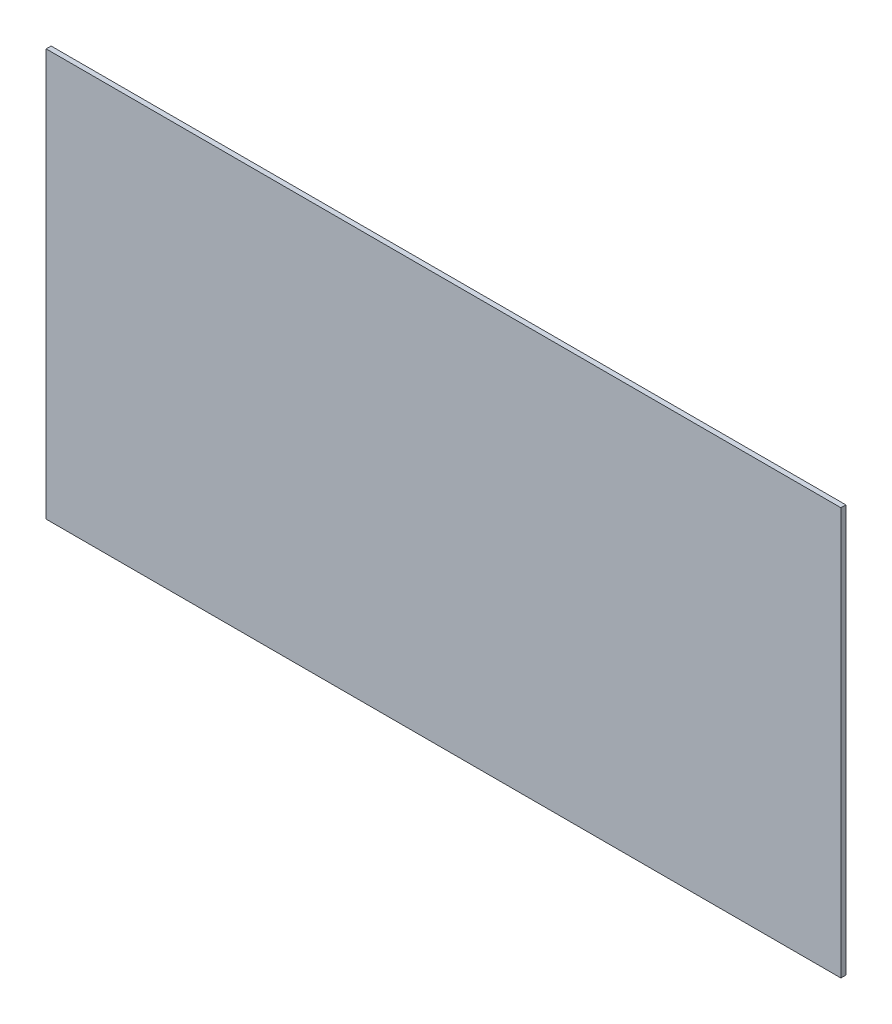
ISO-10303-21;
HEADER;
FILE_DESCRIPTION(('STEP AP214'),'2;1');
FILE_NAME('part.step','',(''),(''),'','','');
FILE_SCHEMA(('AUTOMOTIVE_DESIGN { 1 0 10303 214 1 1 1 1 }'));
ENDSEC;
DATA;
#1=APPLICATION_CONTEXT('core data for automotive mechanical design processes');
#2=APPLICATION_PROTOCOL_DEFINITION('international standard','automotive_design',2000,#1);
#3=PRODUCT_CONTEXT('',#1,'mechanical');
#4=PRODUCT('Part','Part','',(#3));
#5=PRODUCT_RELATED_PRODUCT_CATEGORY('part','',(#4));
#6=PRODUCT_DEFINITION_FORMATION('','',#4);
#7=PRODUCT_DEFINITION_CONTEXT('part definition',#1,'design');
#8=PRODUCT_DEFINITION('design','',#6,#7);
#9=PRODUCT_DEFINITION_SHAPE('','',#8);
#10=(LENGTH_UNIT() NAMED_UNIT(*) SI_UNIT(.MILLI.,.METRE.));
#11=(NAMED_UNIT(*) PLANE_ANGLE_UNIT() SI_UNIT($,.RADIAN.));
#12=(NAMED_UNIT(*) SI_UNIT($,.STERADIAN.) SOLID_ANGLE_UNIT());
#13=UNCERTAINTY_MEASURE_WITH_UNIT(LENGTH_MEASURE(1.E-05),#10,'distance_accuracy_value','');
#14=(GEOMETRIC_REPRESENTATION_CONTEXT(3) GLOBAL_UNCERTAINTY_ASSIGNED_CONTEXT((#13)) GLOBAL_UNIT_ASSIGNED_CONTEXT((#10,
#11,#12)) REPRESENTATION_CONTEXT('',''));
#15=CARTESIAN_POINT('',(0.,0.,0.));
#16=DIRECTION('',(0.,0.,1.));
#17=DIRECTION('',(1.,0.,0.));
#18=AXIS2_PLACEMENT_3D('',#15,#16,#17);
#19=CARTESIAN_POINT('',(254.,-130.175,3.175));
#20=DIRECTION('',(-1.,0.,0.));
#21=DIRECTION('',(0.,0.,1.));
#22=AXIS2_PLACEMENT_3D('',#19,#20,#21);
#23=PLANE('',#22);
#24=DIRECTION('',(0.,1.,0.));
#25=VECTOR('',#24,1.);
#26=CARTESIAN_POINT('',(254.,-130.175,0.));
#27=LINE('',#26,#25);
#28=CARTESIAN_POINT('',(254.,-130.175,0.));
#29=VERTEX_POINT('',#28);
#30=CARTESIAN_POINT('',(254.,130.175,0.));
#31=VERTEX_POINT('',#30);
#32=EDGE_CURVE('E107',#29,#31,#27,.T.);
#33=ORIENTED_EDGE('',*,*,#32,.T.);
#34=DIRECTION('',(0.,0.,-1.));
#35=VECTOR('',#34,1.);
#36=CARTESIAN_POINT('',(254.,130.175,3.175));
#37=LINE('',#36,#35);
#38=CARTESIAN_POINT('',(254.,130.175,3.175));
#39=VERTEX_POINT('',#38);
#40=EDGE_CURVE('E11',#39,#31,#37,.T.);
#41=ORIENTED_EDGE('',*,*,#40,.F.);
#42=DIRECTION('',(0.,1.,0.));
#43=VECTOR('',#42,1.);
#44=CARTESIAN_POINT('',(254.,-130.175,3.175));
#45=LINE('',#44,#43);
#46=CARTESIAN_POINT('',(254.,-130.175,3.175));
#47=VERTEX_POINT('',#46);
#48=EDGE_CURVE('E91',#47,#39,#45,.T.);
#49=ORIENTED_EDGE('',*,*,#48,.F.);
#50=DIRECTION('',(0.,0.,-1.));
#51=VECTOR('',#50,1.);
#52=CARTESIAN_POINT('',(254.,-130.175,3.175));
#53=LINE('',#52,#51);
#54=EDGE_CURVE('E103',#47,#29,#53,.T.);
#55=ORIENTED_EDGE('',*,*,#54,.T.);
#56=EDGE_LOOP('',(#33,#41,#49,#55));
#57=FACE_BOUND('',#56,.T.);
#58=ADVANCED_FACE('F39',(#57),#23,.F.);
#59=CARTESIAN_POINT('',(-254.,130.175,3.175));
#60=DIRECTION('',(0.,-1.,0.));
#61=DIRECTION('',(0.,0.,-1.));
#62=AXIS2_PLACEMENT_3D('',#59,#60,#61);
#63=PLANE('',#62);
#64=DIRECTION('',(-1.,0.,0.));
#65=VECTOR('',#64,1.);
#66=CARTESIAN_POINT('',(-254.,130.175,0.));
#67=LINE('',#66,#65);
#68=CARTESIAN_POINT('',(-254.,130.175,0.));
#69=VERTEX_POINT('',#68);
#70=EDGE_CURVE('E96',#31,#69,#67,.T.);
#71=ORIENTED_EDGE('',*,*,#70,.T.);
#72=DIRECTION('',(0.,0.,-1.));
#73=VECTOR('',#72,1.);
#74=CARTESIAN_POINT('',(-254.,130.175,3.175));
#75=LINE('',#74,#73);
#76=CARTESIAN_POINT('',(-254.,130.175,3.175));
#77=VERTEX_POINT('',#76);
#78=EDGE_CURVE('E48',#77,#69,#75,.T.);
#79=ORIENTED_EDGE('',*,*,#78,.F.);
#80=DIRECTION('',(-1.,0.,0.));
#81=VECTOR('',#80,1.);
#82=CARTESIAN_POINT('',(-254.,130.175,3.175));
#83=LINE('',#82,#81);
#84=EDGE_CURVE('E86',#39,#77,#83,.T.);
#85=ORIENTED_EDGE('',*,*,#84,.F.);
#86=ORIENTED_EDGE('',*,*,#40,.T.);
#87=EDGE_LOOP('',(#71,#79,#85,#86));
#88=FACE_BOUND('',#87,.T.);
#89=ADVANCED_FACE('F95',(#88),#63,.F.);
#90=CARTESIAN_POINT('',(-254.,-130.175,3.175));
#91=DIRECTION('',(1.,0.,0.));
#92=DIRECTION('',(0.,0.,-1.));
#93=AXIS2_PLACEMENT_3D('',#90,#91,#92);
#94=PLANE('',#93);
#95=DIRECTION('',(0.,-1.,0.));
#96=VECTOR('',#95,1.);
#97=CARTESIAN_POINT('',(-254.,-130.175,0.));
#98=LINE('',#97,#96);
#99=CARTESIAN_POINT('',(-254.,-130.175,0.));
#100=VERTEX_POINT('',#99);
#101=EDGE_CURVE('E73',#69,#100,#98,.T.);
#102=ORIENTED_EDGE('',*,*,#101,.T.);
#103=DIRECTION('',(0.,0.,-1.));
#104=VECTOR('',#103,1.);
#105=CARTESIAN_POINT('',(-254.,-130.175,3.175));
#106=LINE('',#105,#104);
#107=CARTESIAN_POINT('',(-254.,-130.175,3.175));
#108=VERTEX_POINT('',#107);
#109=EDGE_CURVE('E98',#108,#100,#106,.T.);
#110=ORIENTED_EDGE('',*,*,#109,.F.);
#111=DIRECTION('',(0.,-1.,0.));
#112=VECTOR('',#111,1.);
#113=CARTESIAN_POINT('',(-254.,-130.175,3.175));
#114=LINE('',#113,#112);
#115=EDGE_CURVE('E89',#77,#108,#114,.T.);
#116=ORIENTED_EDGE('',*,*,#115,.F.);
#117=ORIENTED_EDGE('',*,*,#78,.T.);
#118=EDGE_LOOP('',(#102,#110,#116,#117));
#119=FACE_BOUND('',#118,.T.);
#120=ADVANCED_FACE('F99',(#119),#94,.F.);
#121=CARTESIAN_POINT('',(-254.,-130.175,3.175));
#122=DIRECTION('',(0.,1.,0.));
#123=DIRECTION('',(0.,0.,1.));
#124=AXIS2_PLACEMENT_3D('',#121,#122,#123);
#125=PLANE('',#124);
#126=DIRECTION('',(1.,0.,0.));
#127=VECTOR('',#126,1.);
#128=CARTESIAN_POINT('',(-254.,-130.175,0.));
#129=LINE('',#128,#127);
#130=EDGE_CURVE('E79',#100,#29,#129,.T.);
#131=ORIENTED_EDGE('',*,*,#130,.T.);
#132=ORIENTED_EDGE('',*,*,#54,.F.);
#133=DIRECTION('',(1.,0.,0.));
#134=VECTOR('',#133,1.);
#135=CARTESIAN_POINT('',(-254.,-130.175,3.175));
#136=LINE('',#135,#134);
#137=EDGE_CURVE('E56',#108,#47,#136,.T.);
#138=ORIENTED_EDGE('',*,*,#137,.F.);
#139=ORIENTED_EDGE('',*,*,#109,.T.);
#140=EDGE_LOOP('',(#131,#132,#138,#139));
#141=FACE_BOUND('',#140,.T.);
#142=ADVANCED_FACE('F120',(#141),#125,.F.);
#143=CARTESIAN_POINT('',(0.,0.,3.175));
#144=DIRECTION('',(0.,0.,-1.));
#145=DIRECTION('',(-1.,0.,0.));
#146=AXIS2_PLACEMENT_3D('',#143,#144,#145);
#147=PLANE('',#146);
#148=ORIENTED_EDGE('',*,*,#48,.T.);
#149=ORIENTED_EDGE('',*,*,#84,.T.);
#150=ORIENTED_EDGE('',*,*,#115,.T.);
#151=ORIENTED_EDGE('',*,*,#137,.T.);
#152=EDGE_LOOP('',(#148,#149,#150,#151));
#153=FACE_BOUND('',#152,.T.);
#154=ADVANCED_FACE('F87',(#153),#147,.F.);
#155=CARTESIAN_POINT('',(0.,0.,0.));
#156=DIRECTION('',(0.,0.,-1.));
#157=DIRECTION('',(-1.,0.,0.));
#158=AXIS2_PLACEMENT_3D('',#155,#156,#157);
#159=PLANE('',#158);
#160=ORIENTED_EDGE('',*,*,#32,.F.);
#161=ORIENTED_EDGE('',*,*,#130,.F.);
#162=ORIENTED_EDGE('',*,*,#101,.F.);
#163=ORIENTED_EDGE('',*,*,#70,.F.);
#164=EDGE_LOOP('',(#160,#161,#162,#163));
#165=FACE_BOUND('',#164,.T.);
#166=ADVANCED_FACE('F123',(#165),#159,.T.);
#167=CLOSED_SHELL('',(#58,#89,#120,#142,#154,#166));
#168=MANIFOLD_SOLID_BREP('B2',#167);
#169=ADVANCED_BREP_SHAPE_REPRESENTATION('',(#18,#168),#14);
#170=SHAPE_DEFINITION_REPRESENTATION(#9,#169);
ENDSEC;
END-ISO-10303-21;
